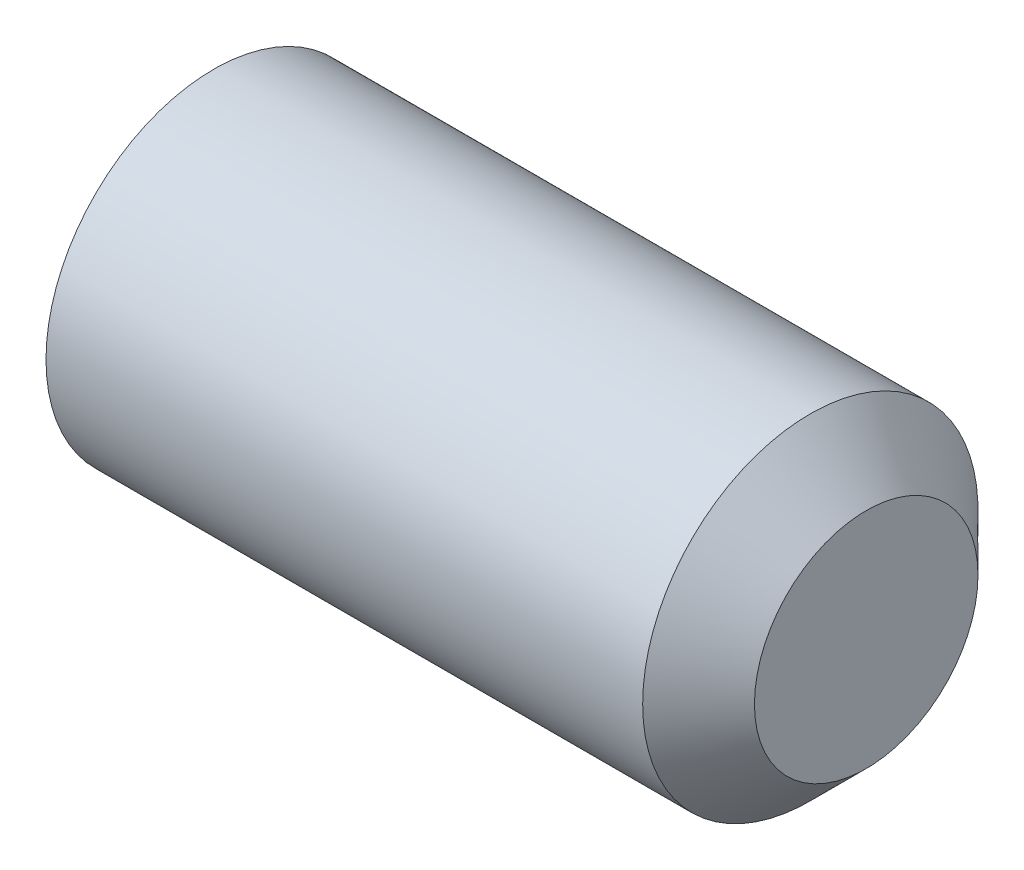
ISO-10303-21;
HEADER;
FILE_DESCRIPTION(('STEP AP214'),'2;1');
FILE_NAME('part.step','',(''),(''),'','','');
FILE_SCHEMA(('AUTOMOTIVE_DESIGN { 1 0 10303 214 1 1 1 1 }'));
ENDSEC;
DATA;
#1=APPLICATION_CONTEXT('core data for automotive mechanical design processes');
#2=APPLICATION_PROTOCOL_DEFINITION('international standard','automotive_design',2000,#1);
#3=PRODUCT_CONTEXT('',#1,'mechanical');
#4=PRODUCT('Part','Part','',(#3));
#5=PRODUCT_RELATED_PRODUCT_CATEGORY('part','',(#4));
#6=PRODUCT_DEFINITION_FORMATION('','',#4);
#7=PRODUCT_DEFINITION_CONTEXT('part definition',#1,'design');
#8=PRODUCT_DEFINITION('design','',#6,#7);
#9=PRODUCT_DEFINITION_SHAPE('','',#8);
#10=(LENGTH_UNIT() NAMED_UNIT(*) SI_UNIT(.MILLI.,.METRE.));
#11=(NAMED_UNIT(*) PLANE_ANGLE_UNIT() SI_UNIT($,.RADIAN.));
#12=(NAMED_UNIT(*) SI_UNIT($,.STERADIAN.) SOLID_ANGLE_UNIT());
#13=UNCERTAINTY_MEASURE_WITH_UNIT(LENGTH_MEASURE(1.E-05),#10,'distance_accuracy_value','');
#14=(GEOMETRIC_REPRESENTATION_CONTEXT(3) GLOBAL_UNCERTAINTY_ASSIGNED_CONTEXT((#13)) GLOBAL_UNIT_ASSIGNED_CONTEXT((#10,
#11,#12)) REPRESENTATION_CONTEXT('',''));
#15=CARTESIAN_POINT('',(0.,0.,0.));
#16=DIRECTION('',(0.,0.,1.));
#17=DIRECTION('',(1.,0.,0.));
#18=AXIS2_PLACEMENT_3D('',#15,#16,#17);
#19=CARTESIAN_POINT('',(0.,0.,0.));
#20=DIRECTION('',(-1.,0.,0.));
#21=DIRECTION('',(0.,0.,1.));
#22=AXIS2_PLACEMENT_3D('',#19,#20,#21);
#23=PLANE('',#22);
#24=CARTESIAN_POINT('',(0.,0.,0.));
#25=DIRECTION('',(-1.,0.,0.));
#26=DIRECTION('',(0.,0.,1.));
#27=AXIS2_PLACEMENT_3D('',#24,#25,#26);
#28=CIRCLE('',#27,1.2195);
#29=CARTESIAN_POINT('',(0.,0.,1.2195));
#30=VERTEX_POINT('',#29);
#31=EDGE_CURVE('E143',#30,#30,#28,.T.);
#32=ORIENTED_EDGE('',*,*,#31,.T.);
#33=EDGE_LOOP('',(#32));
#34=FACE_BOUND('',#33,.T.);
#35=DIRECTION('',(0.,0.,-1.));
#36=VECTOR('',#35,1.);
#37=CARTESIAN_POINT('',(0.,0.75,0.43301270189222));
#38=LINE('',#37,#36);
#39=CARTESIAN_POINT('',(0.,0.75,0.43301270189222));
#40=VERTEX_POINT('',#39);
#41=CARTESIAN_POINT('',(0.,0.75,-0.433012701892219));
#42=VERTEX_POINT('',#41);
#43=EDGE_CURVE('E134',#40,#42,#38,.T.);
#44=ORIENTED_EDGE('',*,*,#43,.F.);
#45=DIRECTION('',(0.,-0.866025403784438,0.5));
#46=VECTOR('',#45,1.);
#47=CARTESIAN_POINT('',(0.,0.75,0.43301270189222));
#48=LINE('',#47,#46);
#49=CARTESIAN_POINT('',(0.,0.,0.866025403784439));
#50=VERTEX_POINT('',#49);
#51=EDGE_CURVE('E56',#40,#50,#48,.T.);
#52=ORIENTED_EDGE('',*,*,#51,.T.);
#53=DIRECTION('',(0.,0.866025403784439,0.5));
#54=VECTOR('',#53,1.);
#55=CARTESIAN_POINT('',(0.,-0.75,0.43301270189222));
#56=LINE('',#55,#54);
#57=CARTESIAN_POINT('',(0.,-0.75,0.43301270189222));
#58=VERTEX_POINT('',#57);
#59=EDGE_CURVE('E125',#58,#50,#56,.T.);
#60=ORIENTED_EDGE('',*,*,#59,.F.);
#61=DIRECTION('',(0.,0.,-1.));
#62=VECTOR('',#61,1.);
#63=CARTESIAN_POINT('',(0.,-0.75,0.43301270189222));
#64=LINE('',#63,#62);
#65=CARTESIAN_POINT('',(0.,-0.75,-0.433012701892219));
#66=VERTEX_POINT('',#65);
#67=EDGE_CURVE('E128',#58,#66,#64,.T.);
#68=ORIENTED_EDGE('',*,*,#67,.T.);
#69=DIRECTION('',(0.,0.866025403784438,-0.500000000000001));
#70=VECTOR('',#69,1.);
#71=CARTESIAN_POINT('',(0.,-0.75,-0.433012701892219));
#72=LINE('',#71,#70);
#73=CARTESIAN_POINT('',(0.,0.,-0.866025403784438));
#74=VERTEX_POINT('',#73);
#75=EDGE_CURVE('E131',#66,#74,#72,.T.);
#76=ORIENTED_EDGE('',*,*,#75,.T.);
#77=DIRECTION('',(0.,-0.866025403784439,-0.5));
#78=VECTOR('',#77,1.);
#79=CARTESIAN_POINT('',(0.,0.75,-0.433012701892219));
#80=LINE('',#79,#78);
#81=EDGE_CURVE('E114',#42,#74,#80,.T.);
#82=ORIENTED_EDGE('',*,*,#81,.F.);
#83=EDGE_LOOP('',(#44,#52,#60,#68,#76,#82));
#84=FACE_BOUND('',#83,.T.);
#85=ADVANCED_FACE('F41',(#34,#84),#23,.T.);
#86=CARTESIAN_POINT('',(6.,1.,0.));
#87=DIRECTION('',(1.,0.,0.));
#88=DIRECTION('',(0.,0.,-1.));
#89=AXIS2_PLACEMENT_3D('',#86,#87,#88);
#90=PLANE('',#89);
#91=CARTESIAN_POINT('',(6.,0.,0.));
#92=DIRECTION('',(-1.,0.,0.));
#93=DIRECTION('',(0.,0.,1.));
#94=AXIS2_PLACEMENT_3D('',#91,#92,#93);
#95=CIRCLE('',#94,1.);
#96=CARTESIAN_POINT('',(6.,0.,1.));
#97=VERTEX_POINT('',#96);
#98=EDGE_CURVE('E11',#97,#97,#95,.T.);
#99=ORIENTED_EDGE('',*,*,#98,.F.);
#100=EDGE_LOOP('',(#99));
#101=FACE_BOUND('',#100,.T.);
#102=ADVANCED_FACE('F43',(#101),#90,.T.);
#103=CARTESIAN_POINT('',(5.50000000000001,0.,0.));
#104=DIRECTION('',(-1.,0.,0.));
#105=DIRECTION('',(0.,0.,1.));
#106=AXIS2_PLACEMENT_3D('',#103,#104,#105);
#107=CONICAL_SURFACE('',#106,1.5,0.785398163397453);
#108=ORIENTED_EDGE('',*,*,#98,.T.);
#109=EDGE_LOOP('',(#108));
#110=FACE_BOUND('',#109,.T.);
#111=CARTESIAN_POINT('',(5.50000000000001,0.,0.));
#112=DIRECTION('',(-1.,0.,0.));
#113=DIRECTION('',(0.,0.,1.));
#114=AXIS2_PLACEMENT_3D('',#111,#112,#113);
#115=CIRCLE('',#114,1.5);
#116=CARTESIAN_POINT('',(5.50000000000001,0.,1.5));
#117=VERTEX_POINT('',#116);
#118=EDGE_CURVE('E49',#117,#117,#115,.T.);
#119=ORIENTED_EDGE('',*,*,#118,.F.);
#120=EDGE_LOOP('',(#119));
#121=FACE_BOUND('',#120,.T.);
#122=ADVANCED_FACE('F154',(#110,#121),#107,.T.);
#123=CARTESIAN_POINT('',(-12.7,0.,0.));
#124=DIRECTION('',(-1.,0.,0.));
#125=DIRECTION('',(0.,0.,1.));
#126=AXIS2_PLACEMENT_3D('',#123,#124,#125);
#127=CYLINDRICAL_SURFACE('',#126,1.5);
#128=ORIENTED_EDGE('',*,*,#118,.T.);
#129=EDGE_LOOP('',(#128));
#130=FACE_BOUND('',#129,.T.);
#131=CARTESIAN_POINT('',(0.161946750507689,0.,0.));
#132=DIRECTION('',(-1.,0.,0.));
#133=DIRECTION('',(0.,0.,1.));
#134=AXIS2_PLACEMENT_3D('',#131,#132,#133);
#135=CIRCLE('',#134,1.5);
#136=CARTESIAN_POINT('',(0.161946750507689,0.,1.5));
#137=VERTEX_POINT('',#136);
#138=EDGE_CURVE('E146',#137,#137,#135,.T.);
#139=ORIENTED_EDGE('',*,*,#138,.F.);
#140=EDGE_LOOP('',(#139));
#141=FACE_BOUND('',#140,.T.);
#142=ADVANCED_FACE('F151',(#130,#141),#127,.T.);
#143=CARTESIAN_POINT('',(0.,0.,0.));
#144=DIRECTION('',(1.,0.,0.));
#145=DIRECTION('',(0.,0.,-1.));
#146=AXIS2_PLACEMENT_3D('',#143,#144,#145);
#147=CONICAL_SURFACE('',#146,1.2195,1.0471975511966);
#148=ORIENTED_EDGE('',*,*,#138,.T.);
#149=EDGE_LOOP('',(#148));
#150=FACE_BOUND('',#149,.T.);
#151=ORIENTED_EDGE('',*,*,#31,.F.);
#152=EDGE_LOOP('',(#151));
#153=FACE_BOUND('',#152,.T.);
#154=ADVANCED_FACE('F161',(#150,#153),#147,.T.);
#155=CARTESIAN_POINT('',(2.,0.75,0.43301270189222));
#156=DIRECTION('',(0.,-0.5,-0.866025403784438));
#157=DIRECTION('',(0.,0.866025403784438,-0.5));
#158=AXIS2_PLACEMENT_3D('',#155,#156,#157);
#159=PLANE('',#158);
#160=ORIENTED_EDGE('',*,*,#51,.F.);
#161=DIRECTION('',(-1.,0.,0.));
#162=VECTOR('',#161,1.);
#163=CARTESIAN_POINT('',(2.,0.75,0.43301270189222));
#164=LINE('',#163,#162);
#165=CARTESIAN_POINT('',(2.,0.75,0.43301270189222));
#166=VERTEX_POINT('',#165);
#167=EDGE_CURVE('E61',#166,#40,#164,.T.);
#168=ORIENTED_EDGE('',*,*,#167,.F.);
#169=DIRECTION('',(0.,-0.866025403784438,0.5));
#170=VECTOR('',#169,1.);
#171=CARTESIAN_POINT('',(2.,0.75,0.43301270189222));
#172=LINE('',#171,#170);
#173=CARTESIAN_POINT('',(2.,0.,0.866025403784439));
#174=VERTEX_POINT('',#173);
#175=EDGE_CURVE('E88',#166,#174,#172,.T.);
#176=ORIENTED_EDGE('',*,*,#175,.T.);
#177=DIRECTION('',(-1.,0.,0.));
#178=VECTOR('',#177,1.);
#179=CARTESIAN_POINT('',(2.,0.,0.866025403784439));
#180=LINE('',#179,#178);
#181=EDGE_CURVE('E141',#174,#50,#180,.T.);
#182=ORIENTED_EDGE('',*,*,#181,.T.);
#183=EDGE_LOOP('',(#160,#168,#176,#182));
#184=FACE_BOUND('',#183,.T.);
#185=ADVANCED_FACE('F172',(#184),#159,.T.);
#186=CARTESIAN_POINT('',(2.,-0.75,0.43301270189222));
#187=DIRECTION('',(0.,-0.5,0.866025403784439));
#188=DIRECTION('',(0.,-0.866025403784439,-0.5));
#189=AXIS2_PLACEMENT_3D('',#186,#187,#188);
#190=PLANE('',#189);
#191=ORIENTED_EDGE('',*,*,#59,.T.);
#192=ORIENTED_EDGE('',*,*,#181,.F.);
#193=DIRECTION('',(0.,0.866025403784439,0.5));
#194=VECTOR('',#193,1.);
#195=CARTESIAN_POINT('',(2.,-0.75,0.43301270189222));
#196=LINE('',#195,#194);
#197=CARTESIAN_POINT('',(2.,-0.75,0.43301270189222));
#198=VERTEX_POINT('',#197);
#199=EDGE_CURVE('E320',#198,#174,#196,.T.);
#200=ORIENTED_EDGE('',*,*,#199,.F.);
#201=DIRECTION('',(-1.,0.,0.));
#202=VECTOR('',#201,1.);
#203=CARTESIAN_POINT('',(2.,-0.75,0.43301270189222));
#204=LINE('',#203,#202);
#205=EDGE_CURVE('E139',#198,#58,#204,.T.);
#206=ORIENTED_EDGE('',*,*,#205,.T.);
#207=EDGE_LOOP('',(#191,#192,#200,#206));
#208=FACE_BOUND('',#207,.T.);
#209=ADVANCED_FACE('F179',(#208),#190,.F.);
#210=CARTESIAN_POINT('',(2.,-0.75,0.43301270189222));
#211=DIRECTION('',(0.,1.,0.));
#212=DIRECTION('',(0.,0.,1.));
#213=AXIS2_PLACEMENT_3D('',#210,#211,#212);
#214=PLANE('',#213);
#215=ORIENTED_EDGE('',*,*,#67,.F.);
#216=ORIENTED_EDGE('',*,*,#205,.F.);
#217=DIRECTION('',(0.,0.,-1.));
#218=VECTOR('',#217,1.);
#219=CARTESIAN_POINT('',(2.,-0.75,0.43301270189222));
#220=LINE('',#219,#218);
#221=CARTESIAN_POINT('',(2.,-0.75,-0.433012701892219));
#222=VERTEX_POINT('',#221);
#223=EDGE_CURVE('E109',#198,#222,#220,.T.);
#224=ORIENTED_EDGE('',*,*,#223,.T.);
#225=DIRECTION('',(-1.,0.,0.));
#226=VECTOR('',#225,1.);
#227=CARTESIAN_POINT('',(2.,-0.75,-0.433012701892219));
#228=LINE('',#227,#226);
#229=EDGE_CURVE('E104',#222,#66,#228,.T.);
#230=ORIENTED_EDGE('',*,*,#229,.T.);
#231=EDGE_LOOP('',(#215,#216,#224,#230));
#232=FACE_BOUND('',#231,.T.);
#233=ADVANCED_FACE('F186',(#232),#214,.T.);
#234=CARTESIAN_POINT('',(2.,-0.75,-0.433012701892219));
#235=DIRECTION('',(0.,0.500000000000001,0.866025403784438));
#236=DIRECTION('',(0.,-0.866025403784438,0.500000000000001));
#237=AXIS2_PLACEMENT_3D('',#234,#235,#236);
#238=PLANE('',#237);
#239=ORIENTED_EDGE('',*,*,#75,.F.);
#240=ORIENTED_EDGE('',*,*,#229,.F.);
#241=DIRECTION('',(0.,0.866025403784438,-0.500000000000001));
#242=VECTOR('',#241,1.);
#243=CARTESIAN_POINT('',(2.,-0.75,-0.433012701892219));
#244=LINE('',#243,#242);
#245=CARTESIAN_POINT('',(2.,0.,-0.866025403784438));
#246=VERTEX_POINT('',#245);
#247=EDGE_CURVE('E99',#222,#246,#244,.T.);
#248=ORIENTED_EDGE('',*,*,#247,.T.);
#249=DIRECTION('',(-1.,0.,0.));
#250=VECTOR('',#249,1.);
#251=CARTESIAN_POINT('',(2.,0.,-0.866025403784438));
#252=LINE('',#251,#250);
#253=EDGE_CURVE('E103',#246,#74,#252,.T.);
#254=ORIENTED_EDGE('',*,*,#253,.T.);
#255=EDGE_LOOP('',(#239,#240,#248,#254));
#256=FACE_BOUND('',#255,.T.);
#257=ADVANCED_FACE('F102',(#256),#238,.T.);
#258=CARTESIAN_POINT('',(2.,0.75,-0.433012701892219));
#259=DIRECTION('',(0.,0.5,-0.866025403784439));
#260=DIRECTION('',(0.,0.866025403784439,0.5));
#261=AXIS2_PLACEMENT_3D('',#258,#259,#260);
#262=PLANE('',#261);
#263=ORIENTED_EDGE('',*,*,#81,.T.);
#264=ORIENTED_EDGE('',*,*,#253,.F.);
#265=DIRECTION('',(0.,-0.866025403784439,-0.5));
#266=VECTOR('',#265,1.);
#267=CARTESIAN_POINT('',(2.,0.75,-0.433012701892219));
#268=LINE('',#267,#266);
#269=CARTESIAN_POINT('',(2.,0.75,-0.433012701892219));
#270=VERTEX_POINT('',#269);
#271=EDGE_CURVE('E108',#270,#246,#268,.T.);
#272=ORIENTED_EDGE('',*,*,#271,.F.);
#273=DIRECTION('',(-1.,0.,0.));
#274=VECTOR('',#273,1.);
#275=CARTESIAN_POINT('',(2.,0.75,-0.433012701892219));
#276=LINE('',#275,#274);
#277=EDGE_CURVE('E84',#270,#42,#276,.T.);
#278=ORIENTED_EDGE('',*,*,#277,.T.);
#279=EDGE_LOOP('',(#263,#264,#272,#278));
#280=FACE_BOUND('',#279,.T.);
#281=ADVANCED_FACE('F111',(#280),#262,.F.);
#282=CARTESIAN_POINT('',(2.,0.75,0.43301270189222));
#283=DIRECTION('',(0.,1.,0.));
#284=DIRECTION('',(0.,0.,1.));
#285=AXIS2_PLACEMENT_3D('',#282,#283,#284);
#286=PLANE('',#285);
#287=ORIENTED_EDGE('',*,*,#43,.T.);
#288=ORIENTED_EDGE('',*,*,#277,.F.);
#289=DIRECTION('',(0.,0.,-1.));
#290=VECTOR('',#289,1.);
#291=CARTESIAN_POINT('',(2.,0.75,0.43301270189222));
#292=LINE('',#291,#290);
#293=EDGE_CURVE('E119',#166,#270,#292,.T.);
#294=ORIENTED_EDGE('',*,*,#293,.F.);
#295=ORIENTED_EDGE('',*,*,#167,.T.);
#296=EDGE_LOOP('',(#287,#288,#294,#295));
#297=FACE_BOUND('',#296,.T.);
#298=ADVANCED_FACE('F198',(#297),#286,.F.);
#299=CARTESIAN_POINT('',(2.,0.,0.866025403784439));
#300=DIRECTION('',(-1.,0.,0.));
#301=DIRECTION('',(0.,0.,1.));
#302=AXIS2_PLACEMENT_3D('',#299,#300,#301);
#303=PLANE('',#302);
#304=ORIENTED_EDGE('',*,*,#175,.F.);
#305=ORIENTED_EDGE('',*,*,#293,.T.);
#306=ORIENTED_EDGE('',*,*,#271,.T.);
#307=ORIENTED_EDGE('',*,*,#247,.F.);
#308=ORIENTED_EDGE('',*,*,#223,.F.);
#309=ORIENTED_EDGE('',*,*,#199,.T.);
#310=EDGE_LOOP('',(#304,#305,#306,#307,#308,#309));
#311=FACE_BOUND('',#310,.T.);
#312=ADVANCED_FACE('F117',(#311),#303,.T.);
#313=CLOSED_SHELL('',(#85,#102,#122,#142,#154,#185,#209,#233,#257,#281,#298,#312));
#314=MANIFOLD_SOLID_BREP('B2',#313);
#315=ADVANCED_BREP_SHAPE_REPRESENTATION('',(#18,#314),#14);
#316=SHAPE_DEFINITION_REPRESENTATION(#9,#315);
ENDSEC;
END-ISO-10303-21;
